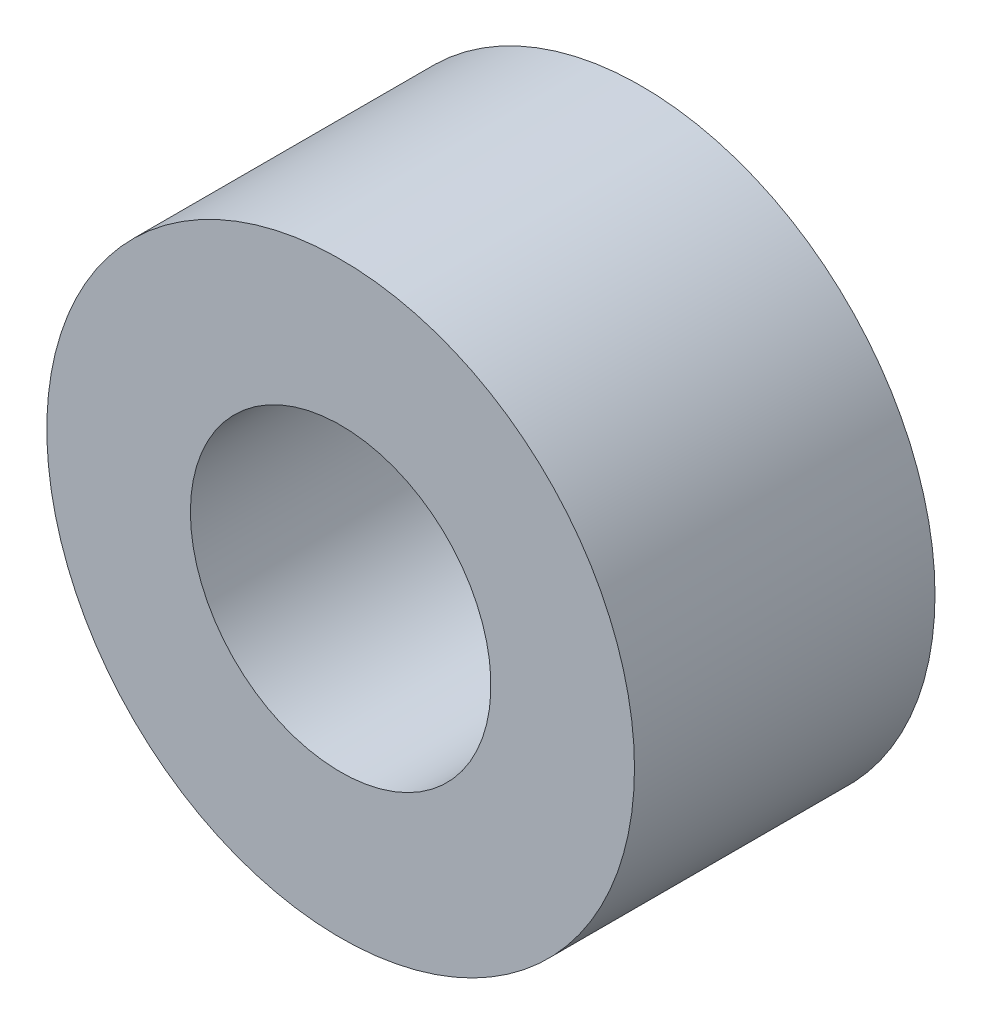
ISO-10303-21;
HEADER;
FILE_DESCRIPTION(('STEP AP214'),'2;1');
FILE_NAME('part.step','',(''),(''),'','','');
FILE_SCHEMA(('AUTOMOTIVE_DESIGN { 1 0 10303 214 1 1 1 1 }'));
ENDSEC;
DATA;
#1=APPLICATION_CONTEXT('core data for automotive mechanical design processes');
#2=APPLICATION_PROTOCOL_DEFINITION('international standard','automotive_design',2000,#1);
#3=PRODUCT_CONTEXT('',#1,'mechanical');
#4=PRODUCT('Part','Part','',(#3));
#5=PRODUCT_RELATED_PRODUCT_CATEGORY('part','',(#4));
#6=PRODUCT_DEFINITION_FORMATION('','',#4);
#7=PRODUCT_DEFINITION_CONTEXT('part definition',#1,'design');
#8=PRODUCT_DEFINITION('design','',#6,#7);
#9=PRODUCT_DEFINITION_SHAPE('','',#8);
#10=(LENGTH_UNIT() NAMED_UNIT(*) SI_UNIT(.MILLI.,.METRE.));
#11=(NAMED_UNIT(*) PLANE_ANGLE_UNIT() SI_UNIT($,.RADIAN.));
#12=(NAMED_UNIT(*) SI_UNIT($,.STERADIAN.) SOLID_ANGLE_UNIT());
#13=UNCERTAINTY_MEASURE_WITH_UNIT(LENGTH_MEASURE(1.E-05),#10,'distance_accuracy_value','');
#14=(GEOMETRIC_REPRESENTATION_CONTEXT(3) GLOBAL_UNCERTAINTY_ASSIGNED_CONTEXT((#13)) GLOBAL_UNIT_ASSIGNED_CONTEXT((#10,
#11,#12)) REPRESENTATION_CONTEXT('',''));
#15=CARTESIAN_POINT('',(0.,0.,0.));
#16=DIRECTION('',(0.,0.,1.));
#17=DIRECTION('',(1.,0.,0.));
#18=AXIS2_PLACEMENT_3D('',#15,#16,#17);
#19=CARTESIAN_POINT('',(0.,0.,3.));
#20=DIRECTION('',(0.,0.,-1.));
#21=DIRECTION('',(-1.,0.,0.));
#22=AXIS2_PLACEMENT_3D('',#19,#20,#21);
#23=CYLINDRICAL_SURFACE('',#22,1.5);
#24=CARTESIAN_POINT('',(0.,0.,0.));
#25=DIRECTION('',(0.,0.,-1.));
#26=DIRECTION('',(-1.,0.,0.));
#27=AXIS2_PLACEMENT_3D('',#24,#25,#26);
#28=CIRCLE('',#27,1.5);
#29=CARTESIAN_POINT('',(-1.5,0.,0.));
#30=VERTEX_POINT('',#29);
#31=EDGE_CURVE('E17',#30,#30,#28,.T.);
#32=ORIENTED_EDGE('',*,*,#31,.T.);
#33=EDGE_LOOP('',(#32));
#34=FACE_BOUND('',#33,.T.);
#35=CARTESIAN_POINT('',(0.,0.,3.));
#36=DIRECTION('',(0.,0.,-1.));
#37=DIRECTION('',(-1.,0.,0.));
#38=AXIS2_PLACEMENT_3D('',#35,#36,#37);
#39=CIRCLE('',#38,1.5);
#40=CARTESIAN_POINT('',(-1.5,0.,3.));
#41=VERTEX_POINT('',#40);
#42=EDGE_CURVE('E30',#41,#41,#39,.T.);
#43=ORIENTED_EDGE('',*,*,#42,.F.);
#44=EDGE_LOOP('',(#43));
#45=FACE_BOUND('',#44,.T.);
#46=ADVANCED_FACE('F14',(#34,#45),#23,.F.);
#47=CARTESIAN_POINT('',(0.,0.,0.));
#48=DIRECTION('',(0.,0.,1.));
#49=DIRECTION('',(1.,0.,0.));
#50=AXIS2_PLACEMENT_3D('',#47,#48,#49);
#51=PLANE('',#50);
#52=ORIENTED_EDGE('',*,*,#31,.F.);
#53=EDGE_LOOP('',(#52));
#54=FACE_BOUND('',#53,.T.);
#55=CARTESIAN_POINT('',(0.,0.,0.));
#56=DIRECTION('',(0.,0.,1.));
#57=DIRECTION('',(1.,0.,0.));
#58=AXIS2_PLACEMENT_3D('',#55,#56,#57);
#59=CIRCLE('',#58,2.9332587096908);
#60=CARTESIAN_POINT('',(2.9332587096908,0.,0.));
#61=VERTEX_POINT('',#60);
#62=EDGE_CURVE('E22',#61,#61,#59,.T.);
#63=ORIENTED_EDGE('',*,*,#62,.F.);
#64=EDGE_LOOP('',(#63));
#65=FACE_BOUND('',#64,.T.);
#66=ADVANCED_FACE('F41',(#54,#65),#51,.F.);
#67=CARTESIAN_POINT('',(0.,0.,3.));
#68=DIRECTION('',(0.,0.,1.));
#69=DIRECTION('',(1.,0.,0.));
#70=AXIS2_PLACEMENT_3D('',#67,#68,#69);
#71=PLANE('',#70);
#72=ORIENTED_EDGE('',*,*,#42,.T.);
#73=EDGE_LOOP('',(#72));
#74=FACE_BOUND('',#73,.T.);
#75=CARTESIAN_POINT('',(0.,0.,3.));
#76=DIRECTION('',(0.,0.,1.));
#77=DIRECTION('',(1.,0.,0.));
#78=AXIS2_PLACEMENT_3D('',#75,#76,#77);
#79=CIRCLE('',#78,2.9332587096908);
#80=CARTESIAN_POINT('',(2.9332587096908,0.,3.));
#81=VERTEX_POINT('',#80);
#82=EDGE_CURVE('E10',#81,#81,#79,.F.);
#83=ORIENTED_EDGE('',*,*,#82,.F.);
#84=EDGE_LOOP('',(#83));
#85=FACE_BOUND('',#84,.T.);
#86=ADVANCED_FACE('F44',(#74,#85),#71,.T.);
#87=CARTESIAN_POINT('',(0.,0.,-8.29650849838746));
#88=DIRECTION('',(0.,0.,1.));
#89=DIRECTION('',(1.,0.,0.));
#90=AXIS2_PLACEMENT_3D('',#87,#88,#89);
#91=CYLINDRICAL_SURFACE('',#90,2.9332587096908);
#92=ORIENTED_EDGE('',*,*,#82,.T.);
#93=EDGE_LOOP('',(#92));
#94=FACE_BOUND('',#93,.T.);
#95=ORIENTED_EDGE('',*,*,#62,.T.);
#96=EDGE_LOOP('',(#95));
#97=FACE_BOUND('',#96,.T.);
#98=ADVANCED_FACE('F47',(#94,#97),#91,.T.);
#99=CLOSED_SHELL('',(#46,#66,#86,#98));
#100=MANIFOLD_SOLID_BREP('B1',#99);
#101=ADVANCED_BREP_SHAPE_REPRESENTATION('',(#18,#100),#14);
#102=SHAPE_DEFINITION_REPRESENTATION(#9,#101);
ENDSEC;
END-ISO-10303-21;
